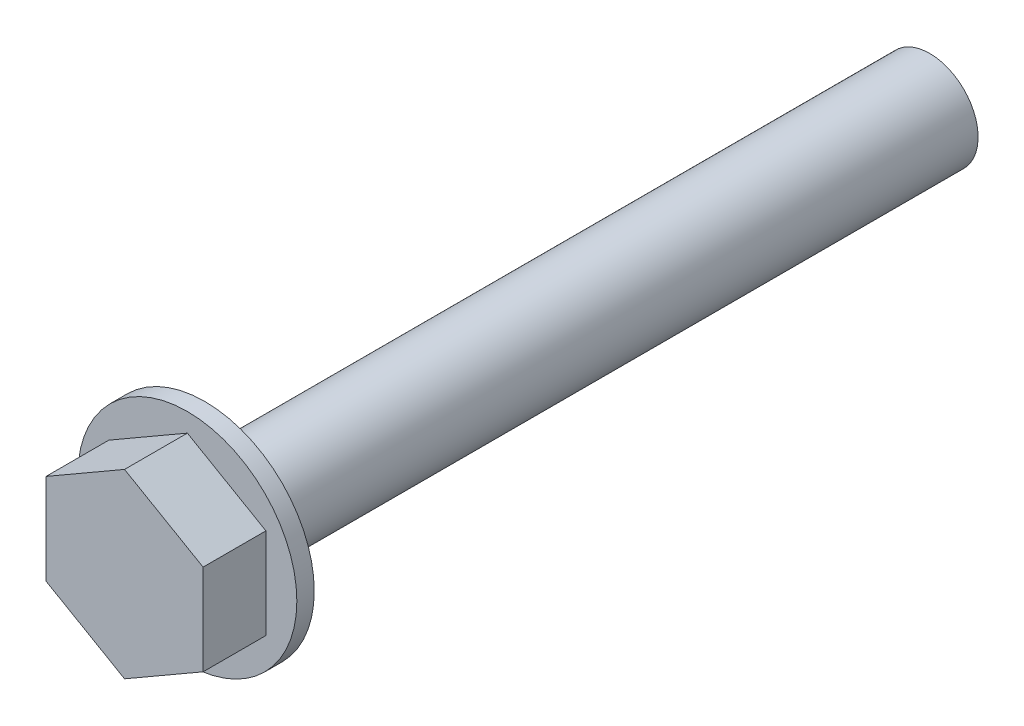
ISO-10303-21;
HEADER;
FILE_DESCRIPTION(('STEP AP214'),'2;1');
FILE_NAME('part.step','',(''),(''),'','','');
FILE_SCHEMA(('AUTOMOTIVE_DESIGN { 1 0 10303 214 1 1 1 1 }'));
ENDSEC;
DATA;
#1=APPLICATION_CONTEXT('core data for automotive mechanical design processes');
#2=APPLICATION_PROTOCOL_DEFINITION('international standard','automotive_design',2000,#1);
#3=PRODUCT_CONTEXT('',#1,'mechanical');
#4=PRODUCT('Part','Part','',(#3));
#5=PRODUCT_RELATED_PRODUCT_CATEGORY('part','',(#4));
#6=PRODUCT_DEFINITION_FORMATION('','',#4);
#7=PRODUCT_DEFINITION_CONTEXT('part definition',#1,'design');
#8=PRODUCT_DEFINITION('design','',#6,#7);
#9=PRODUCT_DEFINITION_SHAPE('','',#8);
#10=(LENGTH_UNIT() NAMED_UNIT(*) SI_UNIT(.MILLI.,.METRE.));
#11=(NAMED_UNIT(*) PLANE_ANGLE_UNIT() SI_UNIT($,.RADIAN.));
#12=(NAMED_UNIT(*) SI_UNIT($,.STERADIAN.) SOLID_ANGLE_UNIT());
#13=UNCERTAINTY_MEASURE_WITH_UNIT(LENGTH_MEASURE(1.E-05),#10,'distance_accuracy_value','');
#14=(GEOMETRIC_REPRESENTATION_CONTEXT(3) GLOBAL_UNCERTAINTY_ASSIGNED_CONTEXT((#13)) GLOBAL_UNIT_ASSIGNED_CONTEXT((#10,
#11,#12)) REPRESENTATION_CONTEXT('',''));
#15=CARTESIAN_POINT('',(0.,0.,0.));
#16=DIRECTION('',(0.,0.,1.));
#17=DIRECTION('',(1.,0.,0.));
#18=AXIS2_PLACEMENT_3D('',#15,#16,#17);
#19=CARTESIAN_POINT('',(6.5,-3.75277674973256,6.64));
#20=DIRECTION('',(-1.,0.,0.));
#21=DIRECTION('',(0.,0.,1.));
#22=AXIS2_PLACEMENT_3D('',#19,#20,#21);
#23=PLANE('',#22);
#24=DIRECTION('',(0.,1.,0.));
#25=VECTOR('',#24,1.);
#26=CARTESIAN_POINT('',(6.5,-3.75277674973256,1.44));
#27=LINE('',#26,#25);
#28=CARTESIAN_POINT('',(6.5,-3.75277674973256,1.44));
#29=VERTEX_POINT('',#28);
#30=CARTESIAN_POINT('',(6.5,3.75277674973257,1.44));
#31=VERTEX_POINT('',#30);
#32=EDGE_CURVE('E95',#29,#31,#27,.T.);
#33=ORIENTED_EDGE('',*,*,#32,.T.);
#34=DIRECTION('',(0.,0.,-1.));
#35=VECTOR('',#34,1.);
#36=CARTESIAN_POINT('',(6.5,3.75277674973257,6.64));
#37=LINE('',#36,#35);
#38=CARTESIAN_POINT('',(6.5,3.75277674973257,6.64));
#39=VERTEX_POINT('',#38);
#40=EDGE_CURVE('E11',#39,#31,#37,.T.);
#41=ORIENTED_EDGE('',*,*,#40,.F.);
#42=DIRECTION('',(0.,1.,0.));
#43=VECTOR('',#42,1.);
#44=CARTESIAN_POINT('',(6.5,-3.75277674973256,6.64));
#45=LINE('',#44,#43);
#46=CARTESIAN_POINT('',(6.5,-3.75277674973256,6.64));
#47=VERTEX_POINT('',#46);
#48=EDGE_CURVE('E124',#47,#39,#45,.T.);
#49=ORIENTED_EDGE('',*,*,#48,.F.);
#50=DIRECTION('',(0.,0.,-1.));
#51=VECTOR('',#50,1.);
#52=CARTESIAN_POINT('',(6.5,-3.75277674973256,6.64));
#53=LINE('',#52,#51);
#54=EDGE_CURVE('E106',#47,#29,#53,.T.);
#55=ORIENTED_EDGE('',*,*,#54,.T.);
#56=EDGE_LOOP('',(#33,#41,#49,#55));
#57=FACE_BOUND('',#56,.T.);
#58=ADVANCED_FACE('F41',(#57),#23,.F.);
#59=CARTESIAN_POINT('',(6.5,3.75277674973257,6.64));
#60=DIRECTION('',(-0.5,-0.866025403784439,0.));
#61=DIRECTION('',(0.866025403784439,-0.5,0.));
#62=AXIS2_PLACEMENT_3D('',#59,#60,#61);
#63=PLANE('',#62);
#64=DIRECTION('',(-0.866025403784439,0.5,0.));
#65=VECTOR('',#64,1.);
#66=CARTESIAN_POINT('',(6.5,3.75277674973257,1.44));
#67=LINE('',#66,#65);
#68=CARTESIAN_POINT('',(0.,7.50555349946513,1.44));
#69=VERTEX_POINT('',#68);
#70=EDGE_CURVE('E90',#31,#69,#67,.T.);
#71=ORIENTED_EDGE('',*,*,#70,.T.);
#72=DIRECTION('',(0.,0.,-1.));
#73=VECTOR('',#72,1.);
#74=CARTESIAN_POINT('',(0.,7.50555349946513,6.64));
#75=LINE('',#74,#73);
#76=CARTESIAN_POINT('',(0.,7.50555349946513,6.64));
#77=VERTEX_POINT('',#76);
#78=EDGE_CURVE('E47',#77,#69,#75,.T.);
#79=ORIENTED_EDGE('',*,*,#78,.F.);
#80=DIRECTION('',(-0.866025403784439,0.5,0.));
#81=VECTOR('',#80,1.);
#82=CARTESIAN_POINT('',(6.5,3.75277674973257,6.64));
#83=LINE('',#82,#81);
#84=EDGE_CURVE('E105',#39,#77,#83,.T.);
#85=ORIENTED_EDGE('',*,*,#84,.F.);
#86=ORIENTED_EDGE('',*,*,#40,.T.);
#87=EDGE_LOOP('',(#71,#79,#85,#86));
#88=FACE_BOUND('',#87,.T.);
#89=ADVANCED_FACE('F101',(#88),#63,.F.);
#90=CARTESIAN_POINT('',(0.,7.50555349946513,6.64));
#91=DIRECTION('',(0.5,-0.866025403784439,0.));
#92=DIRECTION('',(0.866025403784439,0.5,0.));
#93=AXIS2_PLACEMENT_3D('',#90,#91,#92);
#94=PLANE('',#93);
#95=DIRECTION('',(-0.866025403784439,-0.5,0.));
#96=VECTOR('',#95,1.);
#97=CARTESIAN_POINT('',(0.,7.50555349946513,1.44));
#98=LINE('',#97,#96);
#99=CARTESIAN_POINT('',(-6.5,3.75277674973257,1.44));
#100=VERTEX_POINT('',#99);
#101=EDGE_CURVE('E92',#69,#100,#98,.T.);
#102=ORIENTED_EDGE('',*,*,#101,.T.);
#103=DIRECTION('',(0.,0.,-1.));
#104=VECTOR('',#103,1.);
#105=CARTESIAN_POINT('',(-6.5,3.75277674973257,6.64));
#106=LINE('',#105,#104);
#107=CARTESIAN_POINT('',(-6.5,3.75277674973257,6.64));
#108=VERTEX_POINT('',#107);
#109=EDGE_CURVE('E135',#108,#100,#106,.T.);
#110=ORIENTED_EDGE('',*,*,#109,.F.);
#111=DIRECTION('',(-0.866025403784439,-0.5,0.));
#112=VECTOR('',#111,1.);
#113=CARTESIAN_POINT('',(0.,7.50555349946513,6.64));
#114=LINE('',#113,#112);
#115=EDGE_CURVE('E138',#77,#108,#114,.T.);
#116=ORIENTED_EDGE('',*,*,#115,.F.);
#117=ORIENTED_EDGE('',*,*,#78,.T.);
#118=EDGE_LOOP('',(#102,#110,#116,#117));
#119=FACE_BOUND('',#118,.T.);
#120=ADVANCED_FACE('F137',(#119),#94,.F.);
#121=CARTESIAN_POINT('',(-6.5,3.75277674973257,6.64));
#122=DIRECTION('',(1.,0.,0.));
#123=DIRECTION('',(0.,1.,0.));
#124=AXIS2_PLACEMENT_3D('',#121,#122,#123);
#125=PLANE('',#124);
#126=DIRECTION('',(0.,-1.,0.));
#127=VECTOR('',#126,1.);
#128=CARTESIAN_POINT('',(-6.5,3.75277674973257,1.44));
#129=LINE('',#128,#127);
#130=CARTESIAN_POINT('',(-6.5,-3.75277674973257,1.44));
#131=VERTEX_POINT('',#130);
#132=EDGE_CURVE('E117',#100,#131,#129,.T.);
#133=ORIENTED_EDGE('',*,*,#132,.T.);
#134=DIRECTION('',(0.,0.,-1.));
#135=VECTOR('',#134,1.);
#136=CARTESIAN_POINT('',(-6.5,-3.75277674973257,6.64));
#137=LINE('',#136,#135);
#138=CARTESIAN_POINT('',(-6.5,-3.75277674973257,6.64));
#139=VERTEX_POINT('',#138);
#140=EDGE_CURVE('E129',#139,#131,#137,.T.);
#141=ORIENTED_EDGE('',*,*,#140,.F.);
#142=DIRECTION('',(0.,-1.,0.));
#143=VECTOR('',#142,1.);
#144=CARTESIAN_POINT('',(-6.5,3.75277674973257,6.64));
#145=LINE('',#144,#143);
#146=EDGE_CURVE('E136',#108,#139,#145,.T.);
#147=ORIENTED_EDGE('',*,*,#146,.F.);
#148=ORIENTED_EDGE('',*,*,#109,.T.);
#149=EDGE_LOOP('',(#133,#141,#147,#148));
#150=FACE_BOUND('',#149,.T.);
#151=ADVANCED_FACE('F179',(#150),#125,.F.);
#152=CARTESIAN_POINT('',(-6.5,-3.75277674973257,6.64));
#153=DIRECTION('',(0.5,0.866025403784439,0.));
#154=DIRECTION('',(-0.866025403784439,0.5,0.));
#155=AXIS2_PLACEMENT_3D('',#152,#153,#154);
#156=PLANE('',#155);
#157=DIRECTION('',(0.866025403784438,-0.5,0.));
#158=VECTOR('',#157,1.);
#159=CARTESIAN_POINT('',(-6.5,-3.75277674973257,1.44));
#160=LINE('',#159,#158);
#161=CARTESIAN_POINT('',(0.,-7.50555349946513,1.44));
#162=VERTEX_POINT('',#161);
#163=EDGE_CURVE('E116',#131,#162,#160,.T.);
#164=ORIENTED_EDGE('',*,*,#163,.T.);
#165=DIRECTION('',(0.,0.,-1.));
#166=VECTOR('',#165,1.);
#167=CARTESIAN_POINT('',(0.,-7.50555349946513,6.64));
#168=LINE('',#167,#166);
#169=CARTESIAN_POINT('',(0.,-7.50555349946513,6.64));
#170=VERTEX_POINT('',#169);
#171=EDGE_CURVE('E127',#170,#162,#168,.T.);
#172=ORIENTED_EDGE('',*,*,#171,.F.);
#173=DIRECTION('',(0.866025403784438,-0.5,0.));
#174=VECTOR('',#173,1.);
#175=CARTESIAN_POINT('',(-6.5,-3.75277674973257,6.64));
#176=LINE('',#175,#174);
#177=EDGE_CURVE('E142',#139,#170,#176,.T.);
#178=ORIENTED_EDGE('',*,*,#177,.F.);
#179=ORIENTED_EDGE('',*,*,#140,.T.);
#180=EDGE_LOOP('',(#164,#172,#178,#179));
#181=FACE_BOUND('',#180,.T.);
#182=ADVANCED_FACE('F151',(#181),#156,.F.);
#183=CARTESIAN_POINT('',(0.,-7.50555349946513,6.64));
#184=DIRECTION('',(-0.5,0.866025403784439,0.));
#185=DIRECTION('',(-0.866025403784439,-0.5,0.));
#186=AXIS2_PLACEMENT_3D('',#183,#184,#185);
#187=PLANE('',#186);
#188=DIRECTION('',(0.866025403784439,0.5,0.));
#189=VECTOR('',#188,1.);
#190=CARTESIAN_POINT('',(0.,-7.50555349946513,1.44));
#191=LINE('',#190,#189);
#192=EDGE_CURVE('E125',#162,#29,#191,.T.);
#193=ORIENTED_EDGE('',*,*,#192,.T.);
#194=ORIENTED_EDGE('',*,*,#54,.F.);
#195=DIRECTION('',(0.866025403784439,0.5,0.));
#196=VECTOR('',#195,1.);
#197=CARTESIAN_POINT('',(0.,-7.50555349946513,6.64));
#198=LINE('',#197,#196);
#199=EDGE_CURVE('E57',#170,#47,#198,.T.);
#200=ORIENTED_EDGE('',*,*,#199,.F.);
#201=ORIENTED_EDGE('',*,*,#171,.T.);
#202=EDGE_LOOP('',(#193,#194,#200,#201));
#203=FACE_BOUND('',#202,.T.);
#204=ADVANCED_FACE('F153',(#203),#187,.F.);
#205=CARTESIAN_POINT('',(0.,0.,6.64));
#206=DIRECTION('',(0.,0.,1.));
#207=DIRECTION('',(1.,0.,0.));
#208=AXIS2_PLACEMENT_3D('',#205,#206,#207);
#209=PLANE('',#208);
#210=ORIENTED_EDGE('',*,*,#48,.T.);
#211=ORIENTED_EDGE('',*,*,#84,.T.);
#212=ORIENTED_EDGE('',*,*,#115,.T.);
#213=ORIENTED_EDGE('',*,*,#146,.T.);
#214=ORIENTED_EDGE('',*,*,#177,.T.);
#215=ORIENTED_EDGE('',*,*,#199,.T.);
#216=EDGE_LOOP('',(#210,#211,#212,#213,#214,#215));
#217=FACE_BOUND('',#216,.T.);
#218=ADVANCED_FACE('F146',(#217),#209,.T.);
#219=CARTESIAN_POINT('',(0.,0.,1.44));
#220=DIRECTION('',(0.,0.,1.));
#221=DIRECTION('',(1.,0.,0.));
#222=AXIS2_PLACEMENT_3D('',#219,#220,#221);
#223=PLANE('',#222);
#224=CARTESIAN_POINT('',(0.,0.,1.44));
#225=DIRECTION('',(0.,0.,1.));
#226=DIRECTION('',(1.,0.,0.));
#227=AXIS2_PLACEMENT_3D('',#224,#225,#226);
#228=CIRCLE('',#227,9.06);
#229=CARTESIAN_POINT('',(-9.06,0.,1.44));
#230=VERTEX_POINT('',#229);
#231=EDGE_CURVE('E109',#230,#230,#228,.T.);
#232=ORIENTED_EDGE('',*,*,#231,.T.);
#233=EDGE_LOOP('',(#232));
#234=FACE_BOUND('',#233,.T.);
#235=ORIENTED_EDGE('',*,*,#32,.F.);
#236=ORIENTED_EDGE('',*,*,#192,.F.);
#237=ORIENTED_EDGE('',*,*,#163,.F.);
#238=ORIENTED_EDGE('',*,*,#132,.F.);
#239=ORIENTED_EDGE('',*,*,#101,.F.);
#240=ORIENTED_EDGE('',*,*,#70,.F.);
#241=EDGE_LOOP('',(#235,#236,#237,#238,#239,#240));
#242=FACE_BOUND('',#241,.T.);
#243=ADVANCED_FACE('F89',(#234,#242),#223,.T.);
#244=CARTESIAN_POINT('',(0.,0.,1.44));
#245=DIRECTION('',(0.,0.,-1.));
#246=DIRECTION('',(-1.,0.,0.));
#247=AXIS2_PLACEMENT_3D('',#244,#245,#246);
#248=CYLINDRICAL_SURFACE('',#247,9.06);
#249=CARTESIAN_POINT('',(0.,0.,0.));
#250=DIRECTION('',(0.,0.,1.));
#251=DIRECTION('',(1.,0.,0.));
#252=AXIS2_PLACEMENT_3D('',#249,#250,#251);
#253=CIRCLE('',#252,9.06);
#254=CARTESIAN_POINT('',(-9.06,0.,0.));
#255=VERTEX_POINT('',#254);
#256=EDGE_CURVE('E154',#255,#255,#253,.T.);
#257=CARTESIAN_POINT('',(-9.06,0.,1.44));
#258=CARTESIAN_POINT('',(-9.06,0.,1.425));
#259=CARTESIAN_POINT('',(-9.06,0.,1.41));
#260=CARTESIAN_POINT('',(-9.06,0.,1.38));
#261=CARTESIAN_POINT('',(-9.06,0.,1.365));
#262=CARTESIAN_POINT('',(-9.06,0.,1.335));
#263=CARTESIAN_POINT('',(-9.06,0.,1.32));
#264=CARTESIAN_POINT('',(-9.06,0.,1.29));
#265=CARTESIAN_POINT('',(-9.06,0.,1.275));
#266=CARTESIAN_POINT('',(-9.06,0.,1.245));
#267=CARTESIAN_POINT('',(-9.06,0.,1.23));
#268=CARTESIAN_POINT('',(-9.06,0.,1.2));
#269=CARTESIAN_POINT('',(-9.06,0.,1.185));
#270=CARTESIAN_POINT('',(-9.06,0.,1.155));
#271=CARTESIAN_POINT('',(-9.06,0.,1.14));
#272=CARTESIAN_POINT('',(-9.06,0.,1.11));
#273=CARTESIAN_POINT('',(-9.06,0.,1.095));
#274=CARTESIAN_POINT('',(-9.06,0.,1.065));
#275=CARTESIAN_POINT('',(-9.06,0.,1.05));
#276=CARTESIAN_POINT('',(-9.06,0.,1.02));
#277=CARTESIAN_POINT('',(-9.06,0.,1.005));
#278=CARTESIAN_POINT('',(-9.06,0.,0.975));
#279=CARTESIAN_POINT('',(-9.06,0.,0.96));
#280=CARTESIAN_POINT('',(-9.06,0.,0.93));
#281=CARTESIAN_POINT('',(-9.06,0.,0.915));
#282=CARTESIAN_POINT('',(-9.06,0.,0.885));
#283=CARTESIAN_POINT('',(-9.06,0.,0.87));
#284=CARTESIAN_POINT('',(-9.06,0.,0.84));
#285=CARTESIAN_POINT('',(-9.06,0.,0.825));
#286=CARTESIAN_POINT('',(-9.06,0.,0.795));
#287=CARTESIAN_POINT('',(-9.06,0.,0.78));
#288=CARTESIAN_POINT('',(-9.06,0.,0.75));
#289=CARTESIAN_POINT('',(-9.06,0.,0.735));
#290=CARTESIAN_POINT('',(-9.06,0.,0.705));
#291=CARTESIAN_POINT('',(-9.06,0.,0.69));
#292=CARTESIAN_POINT('',(-9.06,0.,0.66));
#293=CARTESIAN_POINT('',(-9.06,0.,0.645));
#294=CARTESIAN_POINT('',(-9.06,0.,0.615));
#295=CARTESIAN_POINT('',(-9.06,0.,0.6));
#296=CARTESIAN_POINT('',(-9.06,0.,0.57));
#297=CARTESIAN_POINT('',(-9.06,0.,0.555));
#298=CARTESIAN_POINT('',(-9.06,0.,0.525));
#299=CARTESIAN_POINT('',(-9.06,0.,0.51));
#300=CARTESIAN_POINT('',(-9.06,0.,0.48));
#301=CARTESIAN_POINT('',(-9.06,0.,0.465));
#302=CARTESIAN_POINT('',(-9.06,0.,0.435));
#303=CARTESIAN_POINT('',(-9.06,0.,0.42));
#304=CARTESIAN_POINT('',(-9.06,0.,0.39));
#305=CARTESIAN_POINT('',(-9.06,0.,0.375));
#306=CARTESIAN_POINT('',(-9.06,0.,0.345));
#307=CARTESIAN_POINT('',(-9.06,0.,0.33));
#308=CARTESIAN_POINT('',(-9.06,0.,0.3));
#309=CARTESIAN_POINT('',(-9.06,0.,0.285));
#310=CARTESIAN_POINT('',(-9.06,0.,0.255));
#311=CARTESIAN_POINT('',(-9.06,0.,0.24));
#312=CARTESIAN_POINT('',(-9.06,0.,0.21));
#313=CARTESIAN_POINT('',(-9.06,0.,0.195));
#314=CARTESIAN_POINT('',(-9.06,0.,0.165));
#315=CARTESIAN_POINT('',(-9.06,0.,0.15));
#316=CARTESIAN_POINT('',(-9.06,0.,0.12));
#317=CARTESIAN_POINT('',(-9.06,0.,0.105));
#318=CARTESIAN_POINT('',(-9.06,0.,0.0749999999999998));
#319=CARTESIAN_POINT('',(-9.06,0.,0.0599999999999997));
#320=CARTESIAN_POINT('',(-9.06,0.,0.0299999999999997));
#321=CARTESIAN_POINT('',(-9.06,0.,0.0149999999999998));
#322=CARTESIAN_POINT('',(-9.06,0.,0.));
#323=B_SPLINE_CURVE_WITH_KNOTS('',3,(#257,#258,#259,#260,#261,#262,#263,#264,#265,#266,#267,
#268,#269,#270,#271,#272,#273,#274,#275,#276,#277,#278,#279,#280,#281,#282,#283,#284,#285,#286,
#287,#288,#289,#290,#291,#292,#293,#294,#295,#296,#297,#298,#299,#300,#301,#302,#303,#304,#305,
#306,#307,#308,#309,#310,#311,#312,#313,#314,#315,#316,#317,#318,#319,#320,#321,#322),
.UNSPECIFIED.,.F.,.F.,(4,2,2,2,2,2,2,2,2,2,2,2,2,2,2,2,2,2,2,2,2,2,2,2,2,2,2,2,2,2,2,2,4),(0.,
0.0449999999999999,0.0899999999999998,0.135,0.18,0.225,0.27,0.315,0.36,0.405,0.45,0.495,0.54,
0.585,0.63,0.675,0.72,0.765,0.81,0.855,0.9,0.945,0.99,1.035,1.08,1.125,1.17,1.215,1.26,1.305,
1.35,1.395,1.44),.UNSPECIFIED.);
#324=EDGE_CURVE('BSEAM192',#230,#255,#323,.T.);
#325=ORIENTED_EDGE('',*,*,#231,.F.);
#326=ORIENTED_EDGE('',*,*,#256,.T.);
#327=ORIENTED_EDGE('',*,*,#324,.T.);
#328=ORIENTED_EDGE('',*,*,#324,.F.);
#329=EDGE_LOOP('',(#325,#327,#326,#328));
#330=FACE_BOUND('',#329,.T.);
#331=ADVANCED_FACE('F192',(#330),#248,.T.);
#332=CARTESIAN_POINT('',(0.,0.,0.));
#333=DIRECTION('',(0.,0.,1.));
#334=DIRECTION('',(1.,0.,0.));
#335=AXIS2_PLACEMENT_3D('',#332,#333,#334);
#336=PLANE('',#335);
#337=CARTESIAN_POINT('',(0.,0.,0.));
#338=DIRECTION('',(0.,0.,1.));
#339=DIRECTION('',(1.,0.,0.));
#340=AXIS2_PLACEMENT_3D('',#337,#338,#339);
#341=CIRCLE('',#340,4.);
#342=CARTESIAN_POINT('',(-4.,0.,0.));
#343=VERTEX_POINT('',#342);
#344=EDGE_CURVE('E110',#343,#343,#341,.F.);
#345=ORIENTED_EDGE('',*,*,#344,.F.);
#346=EDGE_LOOP('',(#345));
#347=FACE_BOUND('',#346,.T.);
#348=ORIENTED_EDGE('',*,*,#256,.F.);
#349=EDGE_LOOP('',(#348));
#350=FACE_BOUND('',#349,.T.);
#351=ADVANCED_FACE('F175',(#347,#350),#336,.F.);
#352=CARTESIAN_POINT('',(0.,0.,0.0100000000000031));
#353=DIRECTION('',(0.,0.,-1.));
#354=DIRECTION('',(-1.,0.,0.));
#355=AXIS2_PLACEMENT_3D('',#352,#353,#354);
#356=CYLINDRICAL_SURFACE('',#355,4.);
#357=CARTESIAN_POINT('',(0.,0.,-60.));
#358=DIRECTION('',(0.,0.,1.));
#359=DIRECTION('',(1.,0.,0.));
#360=AXIS2_PLACEMENT_3D('',#357,#358,#359);
#361=CIRCLE('',#360,4.);
#362=CARTESIAN_POINT('',(-4.,0.,-60.));
#363=VERTEX_POINT('',#362);
#364=EDGE_CURVE('E158',#363,#363,#361,.T.);
#365=CARTESIAN_POINT('',(-4.,0.,-60.));
#366=CARTESIAN_POINT('',(-4.,0.,-59.375));
#367=CARTESIAN_POINT('',(-4.,0.,-58.75));
#368=CARTESIAN_POINT('',(-4.,0.,-57.5));
#369=CARTESIAN_POINT('',(-4.,0.,-56.875));
#370=CARTESIAN_POINT('',(-4.,0.,-55.625));
#371=CARTESIAN_POINT('',(-4.,0.,-55.));
#372=CARTESIAN_POINT('',(-4.,0.,-53.75));
#373=CARTESIAN_POINT('',(-4.,0.,-53.125));
#374=CARTESIAN_POINT('',(-4.,0.,-51.875));
#375=CARTESIAN_POINT('',(-4.,0.,-51.25));
#376=CARTESIAN_POINT('',(-4.,0.,-50.));
#377=CARTESIAN_POINT('',(-4.,0.,-49.375));
#378=CARTESIAN_POINT('',(-4.,0.,-48.125));
#379=CARTESIAN_POINT('',(-4.,0.,-47.5));
#380=CARTESIAN_POINT('',(-4.,0.,-46.25));
#381=CARTESIAN_POINT('',(-4.,0.,-45.625));
#382=CARTESIAN_POINT('',(-4.,0.,-44.375));
#383=CARTESIAN_POINT('',(-4.,0.,-43.75));
#384=CARTESIAN_POINT('',(-4.,0.,-42.5));
#385=CARTESIAN_POINT('',(-4.,0.,-41.875));
#386=CARTESIAN_POINT('',(-4.,0.,-40.625));
#387=CARTESIAN_POINT('',(-4.,0.,-40.));
#388=CARTESIAN_POINT('',(-4.,0.,-38.75));
#389=CARTESIAN_POINT('',(-4.,0.,-38.125));
#390=CARTESIAN_POINT('',(-4.,0.,-36.875));
#391=CARTESIAN_POINT('',(-4.,0.,-36.25));
#392=CARTESIAN_POINT('',(-4.,0.,-35.));
#393=CARTESIAN_POINT('',(-4.,0.,-34.375));
#394=CARTESIAN_POINT('',(-4.,0.,-33.125));
#395=CARTESIAN_POINT('',(-4.,0.,-32.5));
#396=CARTESIAN_POINT('',(-4.,0.,-31.25));
#397=CARTESIAN_POINT('',(-4.,0.,-30.625));
#398=CARTESIAN_POINT('',(-4.,0.,-29.375));
#399=CARTESIAN_POINT('',(-4.,0.,-28.75));
#400=CARTESIAN_POINT('',(-4.,0.,-27.5));
#401=CARTESIAN_POINT('',(-4.,0.,-26.875));
#402=CARTESIAN_POINT('',(-4.,0.,-25.625));
#403=CARTESIAN_POINT('',(-4.,0.,-25.));
#404=CARTESIAN_POINT('',(-4.,0.,-23.75));
#405=CARTESIAN_POINT('',(-4.,0.,-23.125));
#406=CARTESIAN_POINT('',(-4.,0.,-21.875));
#407=CARTESIAN_POINT('',(-4.,0.,-21.25));
#408=CARTESIAN_POINT('',(-4.,0.,-20.));
#409=CARTESIAN_POINT('',(-4.,0.,-19.375));
#410=CARTESIAN_POINT('',(-4.,0.,-18.125));
#411=CARTESIAN_POINT('',(-4.,0.,-17.5));
#412=CARTESIAN_POINT('',(-4.,0.,-16.25));
#413=CARTESIAN_POINT('',(-4.,0.,-15.625));
#414=CARTESIAN_POINT('',(-4.,0.,-14.375));
#415=CARTESIAN_POINT('',(-4.,0.,-13.75));
#416=CARTESIAN_POINT('',(-4.,0.,-12.5));
#417=CARTESIAN_POINT('',(-4.,0.,-11.875));
#418=CARTESIAN_POINT('',(-4.,0.,-10.625));
#419=CARTESIAN_POINT('',(-4.,0.,-10.));
#420=CARTESIAN_POINT('',(-4.,0.,-8.75));
#421=CARTESIAN_POINT('',(-4.,0.,-8.125));
#422=CARTESIAN_POINT('',(-4.,0.,-6.875));
#423=CARTESIAN_POINT('',(-4.,0.,-6.25));
#424=CARTESIAN_POINT('',(-4.,0.,-5.));
#425=CARTESIAN_POINT('',(-4.,0.,-4.375));
#426=CARTESIAN_POINT('',(-4.,0.,-3.125));
#427=CARTESIAN_POINT('',(-4.,0.,-2.5));
#428=CARTESIAN_POINT('',(-4.,0.,-1.25));
#429=CARTESIAN_POINT('',(-4.,0.,-0.625000000000001));
#430=CARTESIAN_POINT('',(-4.,0.,0.));
#431=B_SPLINE_CURVE_WITH_KNOTS('',3,(#365,#366,#367,#368,#369,#370,#371,#372,#373,#374,#375,
#376,#377,#378,#379,#380,#381,#382,#383,#384,#385,#386,#387,#388,#389,#390,#391,#392,#393,#394,
#395,#396,#397,#398,#399,#400,#401,#402,#403,#404,#405,#406,#407,#408,#409,#410,#411,#412,#413,
#414,#415,#416,#417,#418,#419,#420,#421,#422,#423,#424,#425,#426,#427,#428,#429,#430),
.UNSPECIFIED.,.F.,.F.,(4,2,2,2,2,2,2,2,2,2,2,2,2,2,2,2,2,2,2,2,2,2,2,2,2,2,2,2,2,2,2,2,4),(0.,
1.875,3.75,5.625,7.5,9.375,11.25,13.125,15.,16.875,18.75,20.625,22.5,24.375,26.25,28.125,30.,
31.875,33.75,35.625,37.5,39.375,41.25,43.125,45.,46.875,48.75,50.625,52.5,54.375,56.25,58.125,
60.),.UNSPECIFIED.);
#432=EDGE_CURVE('BSEAM163',#363,#343,#431,.T.);
#433=ORIENTED_EDGE('',*,*,#364,.T.);
#434=ORIENTED_EDGE('',*,*,#344,.T.);
#435=ORIENTED_EDGE('',*,*,#432,.T.);
#436=ORIENTED_EDGE('',*,*,#432,.F.);
#437=EDGE_LOOP('',(#433,#435,#434,#436));
#438=FACE_BOUND('',#437,.T.);
#439=ADVANCED_FACE('F163',(#438),#356,.T.);
#440=CARTESIAN_POINT('',(0.,0.,-60.));
#441=DIRECTION('',(0.,0.,1.));
#442=DIRECTION('',(1.,0.,0.));
#443=AXIS2_PLACEMENT_3D('',#440,#441,#442);
#444=PLANE('',#443);
#445=ORIENTED_EDGE('',*,*,#364,.F.);
#446=EDGE_LOOP('',(#445));
#447=FACE_BOUND('',#446,.T.);
#448=ADVANCED_FACE('F170',(#447),#444,.F.);
#449=CLOSED_SHELL('',(#58,#89,#120,#151,#182,#204,#218,#243,#331,#351,#439,#448));
#450=MANIFOLD_SOLID_BREP('B2',#449);
#451=ADVANCED_BREP_SHAPE_REPRESENTATION('',(#18,#450),#14);
#452=SHAPE_DEFINITION_REPRESENTATION(#9,#451);
ENDSEC;
END-ISO-10303-21;
